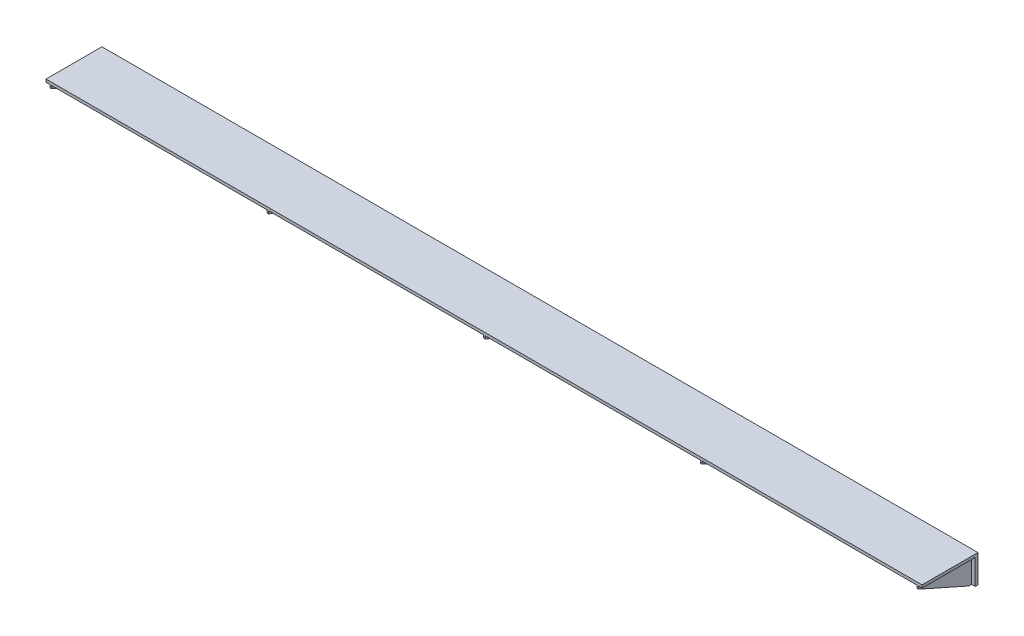
ISO-10303-21;
HEADER;
FILE_DESCRIPTION(('STEP AP214'),'2;1');
FILE_NAME('part.step','',(''),(''),'','','');
FILE_SCHEMA(('AUTOMOTIVE_DESIGN { 1 0 10303 214 1 1 1 1 }'));
ENDSEC;
DATA;
#1=APPLICATION_CONTEXT('core data for automotive mechanical design processes');
#2=APPLICATION_PROTOCOL_DEFINITION('international standard','automotive_design',2000,#1);
#3=PRODUCT_CONTEXT('',#1,'mechanical');
#4=PRODUCT('Part','Part','',(#3));
#5=PRODUCT_RELATED_PRODUCT_CATEGORY('part','',(#4));
#6=PRODUCT_DEFINITION_FORMATION('','',#4);
#7=PRODUCT_DEFINITION_CONTEXT('part definition',#1,'design');
#8=PRODUCT_DEFINITION('design','',#6,#7);
#9=PRODUCT_DEFINITION_SHAPE('','',#8);
#10=(LENGTH_UNIT() NAMED_UNIT(*) SI_UNIT(.MILLI.,.METRE.));
#11=(NAMED_UNIT(*) PLANE_ANGLE_UNIT() SI_UNIT($,.RADIAN.));
#12=(NAMED_UNIT(*) SI_UNIT($,.STERADIAN.) SOLID_ANGLE_UNIT());
#13=UNCERTAINTY_MEASURE_WITH_UNIT(LENGTH_MEASURE(1.E-05),#10,'distance_accuracy_value','');
#14=(GEOMETRIC_REPRESENTATION_CONTEXT(3) GLOBAL_UNCERTAINTY_ASSIGNED_CONTEXT((#13)) GLOBAL_UNIT_ASSIGNED_CONTEXT((#10,
#11,#12)) REPRESENTATION_CONTEXT('',''));
#15=CARTESIAN_POINT('',(0.,0.,0.));
#16=DIRECTION('',(0.,0.,1.));
#17=DIRECTION('',(1.,0.,0.));
#18=AXIS2_PLACEMENT_3D('',#15,#16,#17);
#19=CARTESIAN_POINT('',(0.,0.,20.));
#20=DIRECTION('',(0.,0.,-1.));
#21=DIRECTION('',(-1.,0.,0.));
#22=AXIS2_PLACEMENT_3D('',#19,#20,#21);
#23=PLANE('',#22);
#24=DIRECTION('',(0.,-1.,0.));
#25=VECTOR('',#24,1.);
#26=CARTESIAN_POINT('',(3107.2,80.,20.));
#27=LINE('',#26,#25);
#28=CARTESIAN_POINT('',(3107.2,80.,20.));
#29=VERTEX_POINT('',#28);
#30=CARTESIAN_POINT('',(3107.2,-100.,20.));
#31=VERTEX_POINT('',#30);
#32=EDGE_CURVE('E238',#29,#31,#27,.T.);
#33=ORIENTED_EDGE('',*,*,#32,.T.);
#34=DIRECTION('',(1.,0.,0.));
#35=VECTOR('',#34,1.);
#36=CARTESIAN_POINT('',(-3132.8,-100.,20.));
#37=LINE('',#36,#35);
#38=CARTESIAN_POINT('',(3132.8,-100.,20.));
#39=VERTEX_POINT('',#38);
#40=EDGE_CURVE('E37',#31,#39,#37,.T.);
#41=ORIENTED_EDGE('',*,*,#40,.T.);
#42=DIRECTION('',(0.,1.,0.));
#43=VECTOR('',#42,1.);
#44=CARTESIAN_POINT('',(3132.8,-100.,20.));
#45=LINE('',#44,#43);
#46=CARTESIAN_POINT('',(3132.8,80.,20.));
#47=VERTEX_POINT('',#46);
#48=EDGE_CURVE('E259',#39,#47,#45,.T.);
#49=ORIENTED_EDGE('',*,*,#48,.T.);
#50=DIRECTION('',(1.,0.,0.));
#51=VECTOR('',#50,1.);
#52=CARTESIAN_POINT('',(-3132.8,80.,20.));
#53=LINE('',#52,#51);
#54=EDGE_CURVE('E253',#29,#47,#53,.T.);
#55=ORIENTED_EDGE('',*,*,#54,.F.);
#56=EDGE_LOOP('',(#33,#41,#49,#55));
#57=FACE_BOUND('',#56,.T.);
#58=ADVANCED_FACE('F33',(#57),#23,.F.);
#59=CARTESIAN_POINT('',(-3132.8,80.,400.));
#60=DIRECTION('',(0.,1.,0.));
#61=DIRECTION('',(-1.,0.,0.));
#62=AXIS2_PLACEMENT_3D('',#59,#60,#61);
#63=PLANE('',#62);
#64=DIRECTION('',(0.,0.,-1.));
#65=VECTOR('',#64,1.);
#66=CARTESIAN_POINT('',(3107.2,80.,400.));
#67=LINE('',#66,#65);
#68=CARTESIAN_POINT('',(3107.2,80.,400.));
#69=VERTEX_POINT('',#68);
#70=EDGE_CURVE('E241',#69,#29,#67,.T.);
#71=ORIENTED_EDGE('',*,*,#70,.T.);
#72=ORIENTED_EDGE('',*,*,#54,.T.);
#73=DIRECTION('',(0.,0.,-1.));
#74=VECTOR('',#73,1.);
#75=CARTESIAN_POINT('',(3132.8,80.,400.));
#76=LINE('',#75,#74);
#77=CARTESIAN_POINT('',(3132.8,80.,400.));
#78=VERTEX_POINT('',#77);
#79=EDGE_CURVE('E388',#78,#47,#76,.T.);
#80=ORIENTED_EDGE('',*,*,#79,.F.);
#81=DIRECTION('',(1.,0.,0.));
#82=VECTOR('',#81,1.);
#83=CARTESIAN_POINT('',(-3132.8,80.,400.));
#84=LINE('',#83,#82);
#85=EDGE_CURVE('E255',#69,#78,#84,.T.);
#86=ORIENTED_EDGE('',*,*,#85,.F.);
#87=EDGE_LOOP('',(#71,#72,#80,#86));
#88=FACE_BOUND('',#87,.T.);
#89=ADVANCED_FACE('F251',(#88),#63,.F.);
#90=CARTESIAN_POINT('',(1557.2,-100.,20.));
#91=VERTEX_POINT('',#90);
#92=CARTESIAN_POINT('',(3097.2,-100.,20.));
#93=VERTEX_POINT('',#92);
#94=EDGE_CURVE('E446',#91,#93,#37,.T.);
#95=ORIENTED_EDGE('',*,*,#94,.T.);
#96=DIRECTION('',(0.,-1.,0.));
#97=VECTOR('',#96,1.);
#98=CARTESIAN_POINT('',(3097.2,80.,20.));
#99=LINE('',#98,#97);
#100=CARTESIAN_POINT('',(3097.2,80.,20.));
#101=VERTEX_POINT('',#100);
#102=EDGE_CURVE('E538',#101,#93,#99,.T.);
#103=ORIENTED_EDGE('',*,*,#102,.F.);
#104=CARTESIAN_POINT('',(1557.2,80.,20.));
#105=VERTEX_POINT('',#104);
#106=EDGE_CURVE('E260',#105,#101,#53,.T.);
#107=ORIENTED_EDGE('',*,*,#106,.F.);
#108=DIRECTION('',(0.,-1.,0.));
#109=VECTOR('',#108,1.);
#110=CARTESIAN_POINT('',(1557.2,80.,20.));
#111=LINE('',#110,#109);
#112=EDGE_CURVE('E551',#105,#91,#111,.T.);
#113=ORIENTED_EDGE('',*,*,#112,.T.);
#114=EDGE_LOOP('',(#95,#103,#107,#113));
#115=FACE_BOUND('',#114,.T.);
#116=ADVANCED_FACE('F565',(#115),#23,.F.);
#117=ORIENTED_EDGE('',*,*,#106,.T.);
#118=DIRECTION('',(0.,0.,-1.));
#119=VECTOR('',#118,1.);
#120=CARTESIAN_POINT('',(3097.2,80.,400.));
#121=LINE('',#120,#119);
#122=CARTESIAN_POINT('',(3097.2,80.,400.));
#123=VERTEX_POINT('',#122);
#124=EDGE_CURVE('E536',#123,#101,#121,.T.);
#125=ORIENTED_EDGE('',*,*,#124,.F.);
#126=CARTESIAN_POINT('',(1557.2,80.,400.));
#127=VERTEX_POINT('',#126);
#128=EDGE_CURVE('E511',#127,#123,#84,.T.);
#129=ORIENTED_EDGE('',*,*,#128,.F.);
#130=DIRECTION('',(0.,0.,-1.));
#131=VECTOR('',#130,1.);
#132=CARTESIAN_POINT('',(1557.2,80.,400.));
#133=LINE('',#132,#131);
#134=EDGE_CURVE('E548',#127,#105,#133,.T.);
#135=ORIENTED_EDGE('',*,*,#134,.T.);
#136=EDGE_LOOP('',(#117,#125,#129,#135));
#137=FACE_BOUND('',#136,.T.);
#138=ADVANCED_FACE('F568',(#137),#63,.F.);
#139=CARTESIAN_POINT('',(7.20000000000006,-100.,20.));
#140=VERTEX_POINT('',#139);
#141=CARTESIAN_POINT('',(1547.2,-100.,20.));
#142=VERTEX_POINT('',#141);
#143=EDGE_CURVE('E307',#140,#142,#37,.T.);
#144=ORIENTED_EDGE('',*,*,#143,.T.);
#145=DIRECTION('',(0.,-1.,0.));
#146=VECTOR('',#145,1.);
#147=CARTESIAN_POINT('',(1547.2,80.,20.));
#148=LINE('',#147,#146);
#149=CARTESIAN_POINT('',(1547.2,80.,20.));
#150=VERTEX_POINT('',#149);
#151=EDGE_CURVE('E306',#150,#142,#148,.T.);
#152=ORIENTED_EDGE('',*,*,#151,.F.);
#153=CARTESIAN_POINT('',(7.20000000000006,80.,20.));
#154=VERTEX_POINT('',#153);
#155=EDGE_CURVE('E265',#154,#150,#53,.T.);
#156=ORIENTED_EDGE('',*,*,#155,.F.);
#157=DIRECTION('',(0.,-1.,0.));
#158=VECTOR('',#157,1.);
#159=CARTESIAN_POINT('',(7.20000000000006,80.,20.));
#160=LINE('',#159,#158);
#161=EDGE_CURVE('E303',#154,#140,#160,.T.);
#162=ORIENTED_EDGE('',*,*,#161,.T.);
#163=EDGE_LOOP('',(#144,#152,#156,#162));
#164=FACE_BOUND('',#163,.T.);
#165=ADVANCED_FACE('F302',(#164),#23,.F.);
#166=ORIENTED_EDGE('',*,*,#155,.T.);
#167=DIRECTION('',(0.,0.,-1.));
#168=VECTOR('',#167,1.);
#169=CARTESIAN_POINT('',(1547.2,80.,400.));
#170=LINE('',#169,#168);
#171=CARTESIAN_POINT('',(1547.2,80.,400.));
#172=VERTEX_POINT('',#171);
#173=EDGE_CURVE('E294',#172,#150,#170,.T.);
#174=ORIENTED_EDGE('',*,*,#173,.F.);
#175=CARTESIAN_POINT('',(7.19999999999921,80.,400.));
#176=VERTEX_POINT('',#175);
#177=EDGE_CURVE('E508',#176,#172,#84,.T.);
#178=ORIENTED_EDGE('',*,*,#177,.F.);
#179=DIRECTION('',(0.,0.,-1.));
#180=VECTOR('',#179,1.);
#181=CARTESIAN_POINT('',(7.20000000000006,80.,400.));
#182=LINE('',#181,#180);
#183=EDGE_CURVE('E297',#176,#154,#182,.T.);
#184=ORIENTED_EDGE('',*,*,#183,.T.);
#185=EDGE_LOOP('',(#166,#174,#178,#184));
#186=FACE_BOUND('',#185,.T.);
#187=ADVANCED_FACE('F292',(#186),#63,.F.);
#188=CARTESIAN_POINT('',(-1542.8,-100.,20.));
#189=VERTEX_POINT('',#188);
#190=CARTESIAN_POINT('',(-2.79999999999994,-100.,20.));
#191=VERTEX_POINT('',#190);
#192=EDGE_CURVE('E430',#189,#191,#37,.T.);
#193=ORIENTED_EDGE('',*,*,#192,.T.);
#194=DIRECTION('',(0.,-1.,0.));
#195=VECTOR('',#194,1.);
#196=CARTESIAN_POINT('',(-2.79999999999994,80.,20.));
#197=LINE('',#196,#195);
#198=CARTESIAN_POINT('',(-2.79999999999994,80.,20.));
#199=VERTEX_POINT('',#198);
#200=EDGE_CURVE('E341',#199,#191,#197,.T.);
#201=ORIENTED_EDGE('',*,*,#200,.F.);
#202=CARTESIAN_POINT('',(-1542.8,80.,20.));
#203=VERTEX_POINT('',#202);
#204=EDGE_CURVE('E278',#203,#199,#53,.T.);
#205=ORIENTED_EDGE('',*,*,#204,.F.);
#206=DIRECTION('',(0.,-1.,0.));
#207=VECTOR('',#206,1.);
#208=CARTESIAN_POINT('',(-1542.8,80.,20.));
#209=LINE('',#208,#207);
#210=EDGE_CURVE('E359',#203,#189,#209,.T.);
#211=ORIENTED_EDGE('',*,*,#210,.T.);
#212=EDGE_LOOP('',(#193,#201,#205,#211));
#213=FACE_BOUND('',#212,.T.);
#214=ADVANCED_FACE('F598',(#213),#23,.F.);
#215=ORIENTED_EDGE('',*,*,#204,.T.);
#216=DIRECTION('',(0.,0.,-1.));
#217=VECTOR('',#216,1.);
#218=CARTESIAN_POINT('',(-2.79999999999994,80.,400.));
#219=LINE('',#218,#217);
#220=CARTESIAN_POINT('',(-2.79999999999994,80.,400.));
#221=VERTEX_POINT('',#220);
#222=EDGE_CURVE('E339',#221,#199,#219,.T.);
#223=ORIENTED_EDGE('',*,*,#222,.F.);
#224=CARTESIAN_POINT('',(-1542.8,80.,400.));
#225=VERTEX_POINT('',#224);
#226=EDGE_CURVE('E506',#225,#221,#84,.T.);
#227=ORIENTED_EDGE('',*,*,#226,.F.);
#228=DIRECTION('',(0.,0.,-1.));
#229=VECTOR('',#228,1.);
#230=CARTESIAN_POINT('',(-1542.8,80.,400.));
#231=LINE('',#230,#229);
#232=EDGE_CURVE('E356',#225,#203,#231,.T.);
#233=ORIENTED_EDGE('',*,*,#232,.T.);
#234=EDGE_LOOP('',(#215,#223,#227,#233));
#235=FACE_BOUND('',#234,.T.);
#236=ADVANCED_FACE('F593',(#235),#63,.F.);
#237=CARTESIAN_POINT('',(-3132.8,80.,20.));
#238=VERTEX_POINT('',#237);
#239=CARTESIAN_POINT('',(-3102.8,80.,20.));
#240=VERTEX_POINT('',#239);
#241=EDGE_CURVE('E263',#238,#240,#53,.T.);
#242=ORIENTED_EDGE('',*,*,#241,.F.);
#243=DIRECTION('',(0.,-1.,0.));
#244=VECTOR('',#243,1.);
#245=CARTESIAN_POINT('',(-3132.8,-100.,20.));
#246=LINE('',#245,#244);
#247=CARTESIAN_POINT('',(-3132.8,-100.,20.));
#248=VERTEX_POINT('',#247);
#249=EDGE_CURVE('E436',#238,#248,#246,.T.);
#250=ORIENTED_EDGE('',*,*,#249,.T.);
#251=CARTESIAN_POINT('',(-3102.8,-100.,20.));
#252=VERTEX_POINT('',#251);
#253=EDGE_CURVE('E444',#248,#252,#37,.T.);
#254=ORIENTED_EDGE('',*,*,#253,.T.);
#255=DIRECTION('',(0.,-1.,0.));
#256=VECTOR('',#255,1.);
#257=CARTESIAN_POINT('',(-3102.8,80.,20.));
#258=LINE('',#257,#256);
#259=EDGE_CURVE('E422',#240,#252,#258,.T.);
#260=ORIENTED_EDGE('',*,*,#259,.F.);
#261=EDGE_LOOP('',(#242,#250,#254,#260));
#262=FACE_BOUND('',#261,.T.);
#263=ADVANCED_FACE('F478',(#262),#23,.F.);
#264=CARTESIAN_POINT('',(-3092.8,-100.,20.));
#265=VERTEX_POINT('',#264);
#266=CARTESIAN_POINT('',(-1552.8,-100.,20.));
#267=VERTEX_POINT('',#266);
#268=EDGE_CURVE('E413',#265,#267,#37,.T.);
#269=ORIENTED_EDGE('',*,*,#268,.T.);
#270=DIRECTION('',(0.,-1.,0.));
#271=VECTOR('',#270,1.);
#272=CARTESIAN_POINT('',(-1552.8,80.,20.));
#273=LINE('',#272,#271);
#274=CARTESIAN_POINT('',(-1552.8,80.,20.));
#275=VERTEX_POINT('',#274);
#276=EDGE_CURVE('E371',#275,#267,#273,.T.);
#277=ORIENTED_EDGE('',*,*,#276,.F.);
#278=CARTESIAN_POINT('',(-3092.8,80.,20.));
#279=VERTEX_POINT('',#278);
#280=EDGE_CURVE('E271',#279,#275,#53,.T.);
#281=ORIENTED_EDGE('',*,*,#280,.F.);
#282=DIRECTION('',(0.,-1.,0.));
#283=VECTOR('',#282,1.);
#284=CARTESIAN_POINT('',(-3092.8,80.,20.));
#285=LINE('',#284,#283);
#286=EDGE_CURVE('E403',#279,#265,#285,.T.);
#287=ORIENTED_EDGE('',*,*,#286,.T.);
#288=EDGE_LOOP('',(#269,#277,#281,#287));
#289=FACE_BOUND('',#288,.T.);
#290=ADVANCED_FACE('F496',(#289),#23,.F.);
#291=CARTESIAN_POINT('',(3132.8,-100.,20.));
#292=DIRECTION('',(-1.,0.,0.));
#293=DIRECTION('',(0.,0.,1.));
#294=AXIS2_PLACEMENT_3D('',#291,#292,#293);
#295=PLANE('',#294);
#296=DIRECTION('',(0.,1.,0.));
#297=VECTOR('',#296,1.);
#298=CARTESIAN_POINT('',(3132.8,-100.,0.));
#299=LINE('',#298,#297);
#300=CARTESIAN_POINT('',(3132.8,-100.,0.));
#301=VERTEX_POINT('',#300);
#302=CARTESIAN_POINT('',(3132.8,100.,0.));
#303=VERTEX_POINT('',#302);
#304=EDGE_CURVE('E438',#301,#303,#299,.T.);
#305=ORIENTED_EDGE('',*,*,#304,.T.);
#306=DIRECTION('',(0.,0.,-1.));
#307=VECTOR('',#306,1.);
#308=CARTESIAN_POINT('',(3132.8,100.,20.));
#309=LINE('',#308,#307);
#310=CARTESIAN_POINT('',(3132.8,100.,400.));
#311=VERTEX_POINT('',#310);
#312=EDGE_CURVE('E11',#311,#303,#309,.T.);
#313=ORIENTED_EDGE('',*,*,#312,.F.);
#314=DIRECTION('',(0.,1.,0.));
#315=VECTOR('',#314,1.);
#316=CARTESIAN_POINT('',(3132.8,100.,400.));
#317=LINE('',#316,#315);
#318=EDGE_CURVE('E383',#78,#311,#317,.T.);
#319=ORIENTED_EDGE('',*,*,#318,.F.);
#320=ORIENTED_EDGE('',*,*,#79,.T.);
#321=ORIENTED_EDGE('',*,*,#48,.F.);
#322=DIRECTION('',(0.,0.,-1.));
#323=VECTOR('',#322,1.);
#324=CARTESIAN_POINT('',(3132.8,-100.,20.));
#325=LINE('',#324,#323);
#326=EDGE_CURVE('E487',#39,#301,#325,.T.);
#327=ORIENTED_EDGE('',*,*,#326,.T.);
#328=EDGE_LOOP('',(#305,#313,#319,#320,#321,#327));
#329=FACE_BOUND('',#328,.T.);
#330=ADVANCED_FACE('F35',(#329),#295,.F.);
#331=CARTESIAN_POINT('',(-3132.8,100.,20.));
#332=DIRECTION('',(0.,-1.,0.));
#333=DIRECTION('',(0.,0.,-1.));
#334=AXIS2_PLACEMENT_3D('',#331,#332,#333);
#335=PLANE('',#334);
#336=DIRECTION('',(-1.,0.,0.));
#337=VECTOR('',#336,1.);
#338=CARTESIAN_POINT('',(-3132.8,100.,0.));
#339=LINE('',#338,#337);
#340=CARTESIAN_POINT('',(-3132.8,100.,0.));
#341=VERTEX_POINT('',#340);
#342=EDGE_CURVE('E519',#303,#341,#339,.T.);
#343=ORIENTED_EDGE('',*,*,#342,.T.);
#344=DIRECTION('',(0.,0.,-1.));
#345=VECTOR('',#344,1.);
#346=CARTESIAN_POINT('',(-3132.8,100.,20.));
#347=LINE('',#346,#345);
#348=CARTESIAN_POINT('',(-3132.8,100.,400.));
#349=VERTEX_POINT('',#348);
#350=EDGE_CURVE('E43',#349,#341,#347,.T.);
#351=ORIENTED_EDGE('',*,*,#350,.F.);
#352=DIRECTION('',(-1.,0.,0.));
#353=VECTOR('',#352,1.);
#354=CARTESIAN_POINT('',(-3132.8,100.,400.));
#355=LINE('',#354,#353);
#356=EDGE_CURVE('E386',#311,#349,#355,.T.);
#357=ORIENTED_EDGE('',*,*,#356,.F.);
#358=ORIENTED_EDGE('',*,*,#312,.T.);
#359=EDGE_LOOP('',(#343,#351,#357,#358));
#360=FACE_BOUND('',#359,.T.);
#361=ADVANCED_FACE('F518',(#360),#335,.F.);
#362=CARTESIAN_POINT('',(-3132.8,-100.,20.));
#363=DIRECTION('',(1.,0.,0.));
#364=DIRECTION('',(0.,0.,-1.));
#365=AXIS2_PLACEMENT_3D('',#362,#363,#364);
#366=PLANE('',#365);
#367=DIRECTION('',(0.,-1.,0.));
#368=VECTOR('',#367,1.);
#369=CARTESIAN_POINT('',(-3132.8,-100.,0.));
#370=LINE('',#369,#368);
#371=CARTESIAN_POINT('',(-3132.8,-100.,0.));
#372=VERTEX_POINT('',#371);
#373=EDGE_CURVE('E458',#341,#372,#370,.T.);
#374=ORIENTED_EDGE('',*,*,#373,.T.);
#375=DIRECTION('',(0.,0.,-1.));
#376=VECTOR('',#375,1.);
#377=CARTESIAN_POINT('',(-3132.8,-100.,20.));
#378=LINE('',#377,#376);
#379=EDGE_CURVE('E481',#248,#372,#378,.T.);
#380=ORIENTED_EDGE('',*,*,#379,.F.);
#381=ORIENTED_EDGE('',*,*,#249,.F.);
#382=DIRECTION('',(0.,0.,-1.));
#383=VECTOR('',#382,1.);
#384=CARTESIAN_POINT('',(-3132.8,80.,400.));
#385=LINE('',#384,#383);
#386=CARTESIAN_POINT('',(-3132.8,80.,400.));
#387=VERTEX_POINT('',#386);
#388=EDGE_CURVE('E391',#387,#238,#385,.T.);
#389=ORIENTED_EDGE('',*,*,#388,.F.);
#390=DIRECTION('',(0.,-1.,0.));
#391=VECTOR('',#390,1.);
#392=CARTESIAN_POINT('',(-3132.8,100.,400.));
#393=LINE('',#392,#391);
#394=EDGE_CURVE('E270',#349,#387,#393,.T.);
#395=ORIENTED_EDGE('',*,*,#394,.F.);
#396=ORIENTED_EDGE('',*,*,#350,.T.);
#397=EDGE_LOOP('',(#374,#380,#381,#389,#395,#396));
#398=FACE_BOUND('',#397,.T.);
#399=ADVANCED_FACE('F479',(#398),#366,.F.);
#400=CARTESIAN_POINT('',(-3132.8,-100.,20.));
#401=DIRECTION('',(0.,1.,0.));
#402=DIRECTION('',(0.,0.,1.));
#403=AXIS2_PLACEMENT_3D('',#400,#401,#402);
#404=PLANE('',#403);
#405=DIRECTION('',(1.,0.,0.));
#406=VECTOR('',#405,1.);
#407=CARTESIAN_POINT('',(-3132.8,-100.,0.));
#408=LINE('',#407,#406);
#409=EDGE_CURVE('E457',#372,#301,#408,.T.);
#410=ORIENTED_EDGE('',*,*,#409,.T.);
#411=ORIENTED_EDGE('',*,*,#326,.F.);
#412=ORIENTED_EDGE('',*,*,#40,.F.);
#413=DIRECTION('',(0.,0.,1.));
#414=VECTOR('',#413,1.);
#415=CARTESIAN_POINT('',(3107.2,-100.,20.));
#416=LINE('',#415,#414);
#417=CARTESIAN_POINT('',(3107.2,-100.,40.));
#418=VERTEX_POINT('',#417);
#419=EDGE_CURVE('E245',#31,#418,#416,.T.);
#420=ORIENTED_EDGE('',*,*,#419,.T.);
#421=DIRECTION('',(-1.,0.,0.));
#422=VECTOR('',#421,1.);
#423=CARTESIAN_POINT('',(3107.2,-100.,40.));
#424=LINE('',#423,#422);
#425=CARTESIAN_POINT('',(3097.2,-100.,40.));
#426=VERTEX_POINT('',#425);
#427=EDGE_CURVE('E524',#418,#426,#424,.T.);
#428=ORIENTED_EDGE('',*,*,#427,.T.);
#429=DIRECTION('',(0.,0.,1.));
#430=VECTOR('',#429,1.);
#431=CARTESIAN_POINT('',(3097.2,-100.,20.));
#432=LINE('',#431,#430);
#433=EDGE_CURVE('E541',#93,#426,#432,.T.);
#434=ORIENTED_EDGE('',*,*,#433,.F.);
#435=ORIENTED_EDGE('',*,*,#94,.F.);
#436=DIRECTION('',(0.,0.,1.));
#437=VECTOR('',#436,1.);
#438=CARTESIAN_POINT('',(1557.2,-100.,20.));
#439=LINE('',#438,#437);
#440=CARTESIAN_POINT('',(1557.2,-100.,40.));
#441=VERTEX_POINT('',#440);
#442=EDGE_CURVE('E553',#91,#441,#439,.T.);
#443=ORIENTED_EDGE('',*,*,#442,.T.);
#444=DIRECTION('',(-1.,0.,0.));
#445=VECTOR('',#444,1.);
#446=CARTESIAN_POINT('',(1557.2,-100.,40.));
#447=LINE('',#446,#445);
#448=CARTESIAN_POINT('',(1547.2,-100.,40.));
#449=VERTEX_POINT('',#448);
#450=EDGE_CURVE('E323',#441,#449,#447,.T.);
#451=ORIENTED_EDGE('',*,*,#450,.T.);
#452=DIRECTION('',(0.,0.,1.));
#453=VECTOR('',#452,1.);
#454=CARTESIAN_POINT('',(1547.2,-100.,20.));
#455=LINE('',#454,#453);
#456=EDGE_CURVE('E310',#142,#449,#455,.T.);
#457=ORIENTED_EDGE('',*,*,#456,.F.);
#458=ORIENTED_EDGE('',*,*,#143,.F.);
#459=DIRECTION('',(0.,0.,1.));
#460=VECTOR('',#459,1.);
#461=CARTESIAN_POINT('',(7.20000000000006,-100.,20.));
#462=LINE('',#461,#460);
#463=CARTESIAN_POINT('',(7.20000000000006,-100.,40.));
#464=VERTEX_POINT('',#463);
#465=EDGE_CURVE('E331',#140,#464,#462,.T.);
#466=ORIENTED_EDGE('',*,*,#465,.T.);
#467=DIRECTION('',(-1.,0.,0.));
#468=VECTOR('',#467,1.);
#469=CARTESIAN_POINT('',(7.20000000000006,-100.,40.));
#470=LINE('',#469,#468);
#471=CARTESIAN_POINT('',(-2.79999999999994,-100.,40.));
#472=VERTEX_POINT('',#471);
#473=EDGE_CURVE('E337',#464,#472,#470,.T.);
#474=ORIENTED_EDGE('',*,*,#473,.T.);
#475=DIRECTION('',(0.,0.,1.));
#476=VECTOR('',#475,1.);
#477=CARTESIAN_POINT('',(-2.79999999999994,-100.,20.));
#478=LINE('',#477,#476);
#479=EDGE_CURVE('E344',#191,#472,#478,.T.);
#480=ORIENTED_EDGE('',*,*,#479,.F.);
#481=ORIENTED_EDGE('',*,*,#192,.F.);
#482=DIRECTION('',(0.,0.,1.));
#483=VECTOR('',#482,1.);
#484=CARTESIAN_POINT('',(-1542.8,-100.,20.));
#485=LINE('',#484,#483);
#486=CARTESIAN_POINT('',(-1542.8,-100.,40.));
#487=VERTEX_POINT('',#486);
#488=EDGE_CURVE('E362',#189,#487,#485,.T.);
#489=ORIENTED_EDGE('',*,*,#488,.T.);
#490=DIRECTION('',(-1.,0.,0.));
#491=VECTOR('',#490,1.);
#492=CARTESIAN_POINT('',(-1542.8,-100.,40.));
#493=LINE('',#492,#491);
#494=CARTESIAN_POINT('',(-1552.8,-100.,40.));
#495=VERTEX_POINT('',#494);
#496=EDGE_CURVE('E266',#487,#495,#493,.T.);
#497=ORIENTED_EDGE('',*,*,#496,.T.);
#498=DIRECTION('',(0.,0.,1.));
#499=VECTOR('',#498,1.);
#500=CARTESIAN_POINT('',(-1552.8,-100.,20.));
#501=LINE('',#500,#499);
#502=EDGE_CURVE('E374',#267,#495,#501,.T.);
#503=ORIENTED_EDGE('',*,*,#502,.F.);
#504=ORIENTED_EDGE('',*,*,#268,.F.);
#505=DIRECTION('',(0.,0.,1.));
#506=VECTOR('',#505,1.);
#507=CARTESIAN_POINT('',(-3092.8,-100.,20.));
#508=LINE('',#507,#506);
#509=CARTESIAN_POINT('',(-3092.8,-100.,40.));
#510=VERTEX_POINT('',#509);
#511=EDGE_CURVE('E412',#265,#510,#508,.T.);
#512=ORIENTED_EDGE('',*,*,#511,.T.);
#513=DIRECTION('',(-1.,0.,0.));
#514=VECTOR('',#513,1.);
#515=CARTESIAN_POINT('',(-3092.8,-100.,40.));
#516=LINE('',#515,#514);
#517=CARTESIAN_POINT('',(-3102.8,-100.,40.));
#518=VERTEX_POINT('',#517);
#519=EDGE_CURVE('E461',#510,#518,#516,.T.);
#520=ORIENTED_EDGE('',*,*,#519,.T.);
#521=DIRECTION('',(0.,0.,1.));
#522=VECTOR('',#521,1.);
#523=CARTESIAN_POINT('',(-3102.8,-100.,20.));
#524=LINE('',#523,#522);
#525=EDGE_CURVE('E419',#252,#518,#524,.T.);
#526=ORIENTED_EDGE('',*,*,#525,.F.);
#527=ORIENTED_EDGE('',*,*,#253,.F.);
#528=ORIENTED_EDGE('',*,*,#379,.T.);
#529=EDGE_LOOP('',(#410,#411,#412,#420,#428,#434,#435,#443,#451,#457,#458,#466,#474,#480,#481,
#489,#497,#503,#504,#512,#520,#526,#527,#528));
#530=FACE_BOUND('',#529,.T.);
#531=ADVANCED_FACE('F489',(#530),#404,.F.);
#532=CARTESIAN_POINT('',(0.,0.,0.));
#533=DIRECTION('',(0.,0.,-1.));
#534=DIRECTION('',(-1.,0.,0.));
#535=AXIS2_PLACEMENT_3D('',#532,#533,#534);
#536=PLANE('',#535);
#537=ORIENTED_EDGE('',*,*,#304,.F.);
#538=ORIENTED_EDGE('',*,*,#409,.F.);
#539=ORIENTED_EDGE('',*,*,#373,.F.);
#540=ORIENTED_EDGE('',*,*,#342,.F.);
#541=EDGE_LOOP('',(#537,#538,#539,#540));
#542=FACE_BOUND('',#541,.T.);
#543=ADVANCED_FACE('F523',(#542),#536,.T.);
#544=CARTESIAN_POINT('',(-3092.8,60.,400.));
#545=DIRECTION('',(0.,0.,1.));
#546=DIRECTION('',(1.,0.,0.));
#547=AXIS2_PLACEMENT_3D('',#544,#545,#546);
#548=PLANE('',#547);
#549=DIRECTION('',(0.,1.,0.));
#550=VECTOR('',#549,1.);
#551=CARTESIAN_POINT('',(-3102.8,60.,400.));
#552=LINE('',#551,#550);
#553=CARTESIAN_POINT('',(-3102.8,60.,400.));
#554=VERTEX_POINT('',#553);
#555=CARTESIAN_POINT('',(-3102.8,80.,400.));
#556=VERTEX_POINT('',#555);
#557=EDGE_CURVE('E394',#554,#556,#552,.T.);
#558=ORIENTED_EDGE('',*,*,#557,.F.);
#559=DIRECTION('',(-1.,0.,0.));
#560=VECTOR('',#559,1.);
#561=CARTESIAN_POINT('',(-3092.8,60.,400.));
#562=LINE('',#561,#560);
#563=CARTESIAN_POINT('',(-3092.8,60.,400.));
#564=VERTEX_POINT('',#563);
#565=EDGE_CURVE('E463',#564,#554,#562,.T.);
#566=ORIENTED_EDGE('',*,*,#565,.F.);
#567=DIRECTION('',(0.,1.,0.));
#568=VECTOR('',#567,1.);
#569=CARTESIAN_POINT('',(-3092.8,60.,400.));
#570=LINE('',#569,#568);
#571=CARTESIAN_POINT('',(-3092.8,80.,400.));
#572=VERTEX_POINT('',#571);
#573=EDGE_CURVE('E397',#564,#572,#570,.T.);
#574=ORIENTED_EDGE('',*,*,#573,.T.);
#575=CARTESIAN_POINT('',(-1552.8,80.,400.));
#576=VERTEX_POINT('',#575);
#577=EDGE_CURVE('E384',#572,#576,#84,.T.);
#578=ORIENTED_EDGE('',*,*,#577,.T.);
#579=DIRECTION('',(0.,1.,0.));
#580=VECTOR('',#579,1.);
#581=CARTESIAN_POINT('',(-1552.8,60.,400.));
#582=LINE('',#581,#580);
#583=CARTESIAN_POINT('',(-1552.8,60.,400.));
#584=VERTEX_POINT('',#583);
#585=EDGE_CURVE('E351',#584,#576,#582,.T.);
#586=ORIENTED_EDGE('',*,*,#585,.F.);
#587=DIRECTION('',(-1.,0.,0.));
#588=VECTOR('',#587,1.);
#589=CARTESIAN_POINT('',(-1542.8,60.,400.));
#590=LINE('',#589,#588);
#591=CARTESIAN_POINT('',(-1542.8,60.,400.));
#592=VERTEX_POINT('',#591);
#593=EDGE_CURVE('E261',#592,#584,#590,.T.);
#594=ORIENTED_EDGE('',*,*,#593,.F.);
#595=DIRECTION('',(0.,1.,0.));
#596=VECTOR('',#595,1.);
#597=CARTESIAN_POINT('',(-1542.8,60.,400.));
#598=LINE('',#597,#596);
#599=EDGE_CURVE('E353',#592,#225,#598,.T.);
#600=ORIENTED_EDGE('',*,*,#599,.T.);
#601=ORIENTED_EDGE('',*,*,#226,.T.);
#602=DIRECTION('',(0.,1.,0.));
#603=VECTOR('',#602,1.);
#604=CARTESIAN_POINT('',(-2.79999999999994,60.,400.));
#605=LINE('',#604,#603);
#606=CARTESIAN_POINT('',(-2.79999999999994,60.,400.));
#607=VERTEX_POINT('',#606);
#608=EDGE_CURVE('E322',#607,#221,#605,.T.);
#609=ORIENTED_EDGE('',*,*,#608,.F.);
#610=DIRECTION('',(-1.,0.,0.));
#611=VECTOR('',#610,1.);
#612=CARTESIAN_POINT('',(7.20000000000006,60.,400.));
#613=LINE('',#612,#611);
#614=CARTESIAN_POINT('',(7.20000000000006,60.,400.));
#615=VERTEX_POINT('',#614);
#616=EDGE_CURVE('E349',#615,#607,#613,.T.);
#617=ORIENTED_EDGE('',*,*,#616,.F.);
#618=DIRECTION('',(0.,1.,0.));
#619=VECTOR('',#618,1.);
#620=CARTESIAN_POINT('',(7.20000000000006,60.,400.));
#621=LINE('',#620,#619);
#622=EDGE_CURVE('E326',#615,#176,#621,.T.);
#623=ORIENTED_EDGE('',*,*,#622,.T.);
#624=ORIENTED_EDGE('',*,*,#177,.T.);
#625=DIRECTION('',(0.,1.,0.));
#626=VECTOR('',#625,1.);
#627=CARTESIAN_POINT('',(1547.2,60.,400.));
#628=LINE('',#627,#626);
#629=CARTESIAN_POINT('',(1547.2,60.,400.));
#630=VERTEX_POINT('',#629);
#631=EDGE_CURVE('E314',#630,#172,#628,.T.);
#632=ORIENTED_EDGE('',*,*,#631,.F.);
#633=DIRECTION('',(-1.,0.,0.));
#634=VECTOR('',#633,1.);
#635=CARTESIAN_POINT('',(1557.2,60.,400.));
#636=LINE('',#635,#634);
#637=CARTESIAN_POINT('',(1557.2,60.,400.));
#638=VERTEX_POINT('',#637);
#639=EDGE_CURVE('E320',#638,#630,#636,.T.);
#640=ORIENTED_EDGE('',*,*,#639,.F.);
#641=DIRECTION('',(0.,1.,0.));
#642=VECTOR('',#641,1.);
#643=CARTESIAN_POINT('',(1557.2,60.,400.));
#644=LINE('',#643,#642);
#645=EDGE_CURVE('E58',#638,#127,#644,.T.);
#646=ORIENTED_EDGE('',*,*,#645,.T.);
#647=ORIENTED_EDGE('',*,*,#128,.T.);
#648=DIRECTION('',(0.,1.,0.));
#649=VECTOR('',#648,1.);
#650=CARTESIAN_POINT('',(3097.2,60.,400.));
#651=LINE('',#650,#649);
#652=CARTESIAN_POINT('',(3097.2,60.,400.));
#653=VERTEX_POINT('',#652);
#654=EDGE_CURVE('E534',#653,#123,#651,.T.);
#655=ORIENTED_EDGE('',*,*,#654,.F.);
#656=DIRECTION('',(-1.,0.,0.));
#657=VECTOR('',#656,1.);
#658=CARTESIAN_POINT('',(3107.2,60.,400.));
#659=LINE('',#658,#657);
#660=CARTESIAN_POINT('',(3107.2,60.,400.));
#661=VERTEX_POINT('',#660);
#662=EDGE_CURVE('E531',#661,#653,#659,.T.);
#663=ORIENTED_EDGE('',*,*,#662,.F.);
#664=DIRECTION('',(0.,1.,0.));
#665=VECTOR('',#664,1.);
#666=CARTESIAN_POINT('',(3107.2,60.,400.));
#667=LINE('',#666,#665);
#668=EDGE_CURVE('E51',#661,#69,#667,.T.);
#669=ORIENTED_EDGE('',*,*,#668,.T.);
#670=ORIENTED_EDGE('',*,*,#85,.T.);
#671=ORIENTED_EDGE('',*,*,#318,.T.);
#672=ORIENTED_EDGE('',*,*,#356,.T.);
#673=ORIENTED_EDGE('',*,*,#394,.T.);
#674=EDGE_CURVE('E380',#387,#556,#84,.T.);
#675=ORIENTED_EDGE('',*,*,#674,.T.);
#676=EDGE_LOOP('',(#558,#566,#574,#578,#586,#594,#600,#601,#609,#617,#623,#624,#632,#640,#646,
#647,#655,#663,#669,#670,#671,#672,#673,#675));
#677=FACE_BOUND('',#676,.T.);
#678=ADVANCED_FACE('F473',(#677),#548,.T.);
#679=CARTESIAN_POINT('',(-3092.8,-100.,40.));
#680=DIRECTION('',(0.,-0.913811548620257,0.406138466053448));
#681=DIRECTION('',(0.,-0.406138466053448,-0.913811548620257));
#682=AXIS2_PLACEMENT_3D('',#679,#680,#681);
#683=PLANE('',#682);
#684=DIRECTION('',(0.,0.406138466053448,0.913811548620257));
#685=VECTOR('',#684,1.);
#686=CARTESIAN_POINT('',(-3102.8,-100.,40.));
#687=LINE('',#686,#685);
#688=EDGE_CURVE('E401',#518,#554,#687,.T.);
#689=ORIENTED_EDGE('',*,*,#688,.F.);
#690=ORIENTED_EDGE('',*,*,#519,.F.);
#691=DIRECTION('',(0.,0.406138466053448,0.913811548620257));
#692=VECTOR('',#691,1.);
#693=CARTESIAN_POINT('',(-3092.8,-100.,40.));
#694=LINE('',#693,#692);
#695=EDGE_CURVE('E406',#510,#564,#694,.T.);
#696=ORIENTED_EDGE('',*,*,#695,.T.);
#697=ORIENTED_EDGE('',*,*,#565,.T.);
#698=EDGE_LOOP('',(#689,#690,#696,#697));
#699=FACE_BOUND('',#698,.T.);
#700=ADVANCED_FACE('F664',(#699),#683,.T.);
#701=CARTESIAN_POINT('',(-3092.8,0.,0.));
#702=DIRECTION('',(-1.,0.,0.));
#703=DIRECTION('',(0.,0.,1.));
#704=AXIS2_PLACEMENT_3D('',#701,#702,#703);
#705=PLANE('',#704);
#706=ORIENTED_EDGE('',*,*,#573,.F.);
#707=ORIENTED_EDGE('',*,*,#695,.F.);
#708=ORIENTED_EDGE('',*,*,#511,.F.);
#709=ORIENTED_EDGE('',*,*,#286,.F.);
#710=DIRECTION('',(0.,0.,-1.));
#711=VECTOR('',#710,1.);
#712=CARTESIAN_POINT('',(-3092.8,80.,400.));
#713=LINE('',#712,#711);
#714=EDGE_CURVE('E400',#572,#279,#713,.T.);
#715=ORIENTED_EDGE('',*,*,#714,.F.);
#716=EDGE_LOOP('',(#706,#707,#708,#709,#715));
#717=FACE_BOUND('',#716,.T.);
#718=ADVANCED_FACE('F804',(#717),#705,.F.);
#719=CARTESIAN_POINT('',(-3102.8,0.,0.));
#720=DIRECTION('',(-1.,0.,0.));
#721=DIRECTION('',(0.,0.,1.));
#722=AXIS2_PLACEMENT_3D('',#719,#720,#721);
#723=PLANE('',#722);
#724=ORIENTED_EDGE('',*,*,#557,.T.);
#725=DIRECTION('',(0.,0.,-1.));
#726=VECTOR('',#725,1.);
#727=CARTESIAN_POINT('',(-3102.8,80.,400.));
#728=LINE('',#727,#726);
#729=EDGE_CURVE('E427',#556,#240,#728,.T.);
#730=ORIENTED_EDGE('',*,*,#729,.T.);
#731=ORIENTED_EDGE('',*,*,#259,.T.);
#732=ORIENTED_EDGE('',*,*,#525,.T.);
#733=ORIENTED_EDGE('',*,*,#688,.T.);
#734=EDGE_LOOP('',(#724,#730,#731,#732,#733));
#735=FACE_BOUND('',#734,.T.);
#736=ADVANCED_FACE('F470',(#735),#723,.T.);
#737=ORIENTED_EDGE('',*,*,#280,.T.);
#738=DIRECTION('',(0.,0.,-1.));
#739=VECTOR('',#738,1.);
#740=CARTESIAN_POINT('',(-1552.8,80.,400.));
#741=LINE('',#740,#739);
#742=EDGE_CURVE('E369',#576,#275,#741,.T.);
#743=ORIENTED_EDGE('',*,*,#742,.F.);
#744=ORIENTED_EDGE('',*,*,#577,.F.);
#745=ORIENTED_EDGE('',*,*,#714,.T.);
#746=EDGE_LOOP('',(#737,#743,#744,#745));
#747=FACE_BOUND('',#746,.T.);
#748=ADVANCED_FACE('F504',(#747),#63,.F.);
#749=ORIENTED_EDGE('',*,*,#729,.F.);
#750=ORIENTED_EDGE('',*,*,#674,.F.);
#751=ORIENTED_EDGE('',*,*,#388,.T.);
#752=ORIENTED_EDGE('',*,*,#241,.T.);
#753=EDGE_LOOP('',(#749,#750,#751,#752));
#754=FACE_BOUND('',#753,.T.);
#755=ADVANCED_FACE('F476',(#754),#63,.F.);
#756=CARTESIAN_POINT('',(-1542.8,-100.,40.));
#757=DIRECTION('',(0.,-0.913811548620257,0.406138466053448));
#758=DIRECTION('',(0.,-0.406138466053448,-0.913811548620257));
#759=AXIS2_PLACEMENT_3D('',#756,#757,#758);
#760=PLANE('',#759);
#761=DIRECTION('',(0.,0.406138466053448,0.913811548620257));
#762=VECTOR('',#761,1.);
#763=CARTESIAN_POINT('',(-1552.8,-100.,40.));
#764=LINE('',#763,#762);
#765=EDGE_CURVE('E357',#495,#584,#764,.T.);
#766=ORIENTED_EDGE('',*,*,#765,.F.);
#767=ORIENTED_EDGE('',*,*,#496,.F.);
#768=DIRECTION('',(0.,0.406138466053448,0.913811548620257));
#769=VECTOR('',#768,1.);
#770=CARTESIAN_POINT('',(-1542.8,-100.,40.));
#771=LINE('',#770,#769);
#772=EDGE_CURVE('E365',#487,#592,#771,.T.);
#773=ORIENTED_EDGE('',*,*,#772,.T.);
#774=ORIENTED_EDGE('',*,*,#593,.T.);
#775=EDGE_LOOP('',(#766,#767,#773,#774));
#776=FACE_BOUND('',#775,.T.);
#777=ADVANCED_FACE('F680',(#776),#760,.T.);
#778=CARTESIAN_POINT('',(-1542.8,0.,0.));
#779=DIRECTION('',(-1.,0.,0.));
#780=DIRECTION('',(0.,0.,1.));
#781=AXIS2_PLACEMENT_3D('',#778,#779,#780);
#782=PLANE('',#781);
#783=ORIENTED_EDGE('',*,*,#599,.F.);
#784=ORIENTED_EDGE('',*,*,#772,.F.);
#785=ORIENTED_EDGE('',*,*,#488,.F.);
#786=ORIENTED_EDGE('',*,*,#210,.F.);
#787=ORIENTED_EDGE('',*,*,#232,.F.);
#788=EDGE_LOOP('',(#783,#784,#785,#786,#787));
#789=FACE_BOUND('',#788,.T.);
#790=ADVANCED_FACE('F684',(#789),#782,.F.);
#791=CARTESIAN_POINT('',(-1552.8,0.,0.));
#792=DIRECTION('',(-1.,0.,0.));
#793=DIRECTION('',(0.,0.,1.));
#794=AXIS2_PLACEMENT_3D('',#791,#792,#793);
#795=PLANE('',#794);
#796=ORIENTED_EDGE('',*,*,#585,.T.);
#797=ORIENTED_EDGE('',*,*,#742,.T.);
#798=ORIENTED_EDGE('',*,*,#276,.T.);
#799=ORIENTED_EDGE('',*,*,#502,.T.);
#800=ORIENTED_EDGE('',*,*,#765,.T.);
#801=EDGE_LOOP('',(#796,#797,#798,#799,#800));
#802=FACE_BOUND('',#801,.T.);
#803=ADVANCED_FACE('F501',(#802),#795,.T.);
#804=CARTESIAN_POINT('',(7.20000000000006,-100.,40.));
#805=DIRECTION('',(0.,-0.913811548620257,0.406138466053448));
#806=DIRECTION('',(0.,-0.406138466053448,-0.913811548620257));
#807=AXIS2_PLACEMENT_3D('',#804,#805,#806);
#808=PLANE('',#807);
#809=DIRECTION('',(0.,0.406138466053448,0.913811548620257));
#810=VECTOR('',#809,1.);
#811=CARTESIAN_POINT('',(-2.79999999999994,-100.,40.));
#812=LINE('',#811,#810);
#813=EDGE_CURVE('E328',#472,#607,#812,.T.);
#814=ORIENTED_EDGE('',*,*,#813,.F.);
#815=ORIENTED_EDGE('',*,*,#473,.F.);
#816=DIRECTION('',(0.,0.406138466053448,0.913811548620257));
#817=VECTOR('',#816,1.);
#818=CARTESIAN_POINT('',(7.20000000000006,-100.,40.));
#819=LINE('',#818,#817);
#820=EDGE_CURVE('E334',#464,#615,#819,.T.);
#821=ORIENTED_EDGE('',*,*,#820,.T.);
#822=ORIENTED_EDGE('',*,*,#616,.T.);
#823=EDGE_LOOP('',(#814,#815,#821,#822));
#824=FACE_BOUND('',#823,.T.);
#825=ADVANCED_FACE('F702',(#824),#808,.T.);
#826=CARTESIAN_POINT('',(7.20000000000006,0.,0.));
#827=DIRECTION('',(-1.,0.,0.));
#828=DIRECTION('',(0.,0.,1.));
#829=AXIS2_PLACEMENT_3D('',#826,#827,#828);
#830=PLANE('',#829);
#831=ORIENTED_EDGE('',*,*,#622,.F.);
#832=ORIENTED_EDGE('',*,*,#820,.F.);
#833=ORIENTED_EDGE('',*,*,#465,.F.);
#834=ORIENTED_EDGE('',*,*,#161,.F.);
#835=ORIENTED_EDGE('',*,*,#183,.F.);
#836=EDGE_LOOP('',(#831,#832,#833,#834,#835));
#837=FACE_BOUND('',#836,.T.);
#838=ADVANCED_FACE('F711',(#837),#830,.F.);
#839=CARTESIAN_POINT('',(-2.79999999999994,0.,0.));
#840=DIRECTION('',(-1.,0.,0.));
#841=DIRECTION('',(0.,0.,1.));
#842=AXIS2_PLACEMENT_3D('',#839,#840,#841);
#843=PLANE('',#842);
#844=ORIENTED_EDGE('',*,*,#608,.T.);
#845=ORIENTED_EDGE('',*,*,#222,.T.);
#846=ORIENTED_EDGE('',*,*,#200,.T.);
#847=ORIENTED_EDGE('',*,*,#479,.T.);
#848=ORIENTED_EDGE('',*,*,#813,.T.);
#849=EDGE_LOOP('',(#844,#845,#846,#847,#848));
#850=FACE_BOUND('',#849,.T.);
#851=ADVANCED_FACE('F721',(#850),#843,.T.);
#852=CARTESIAN_POINT('',(1557.2,-100.,40.));
#853=DIRECTION('',(0.,-0.913811548620257,0.406138466053448));
#854=DIRECTION('',(0.,-0.406138466053448,-0.913811548620257));
#855=AXIS2_PLACEMENT_3D('',#852,#853,#854);
#856=PLANE('',#855);
#857=DIRECTION('',(0.,0.406138466053448,0.913811548620257));
#858=VECTOR('',#857,1.);
#859=CARTESIAN_POINT('',(1547.2,-100.,40.));
#860=LINE('',#859,#858);
#861=EDGE_CURVE('E312',#449,#630,#860,.T.);
#862=ORIENTED_EDGE('',*,*,#861,.F.);
#863=ORIENTED_EDGE('',*,*,#450,.F.);
#864=DIRECTION('',(0.,0.406138466053448,0.913811548620257));
#865=VECTOR('',#864,1.);
#866=CARTESIAN_POINT('',(1557.2,-100.,40.));
#867=LINE('',#866,#865);
#868=EDGE_CURVE('E325',#441,#638,#867,.T.);
#869=ORIENTED_EDGE('',*,*,#868,.T.);
#870=ORIENTED_EDGE('',*,*,#639,.T.);
#871=EDGE_LOOP('',(#862,#863,#869,#870));
#872=FACE_BOUND('',#871,.T.);
#873=ADVANCED_FACE('F563',(#872),#856,.T.);
#874=CARTESIAN_POINT('',(1557.2,0.,0.));
#875=DIRECTION('',(-1.,0.,0.));
#876=DIRECTION('',(0.,0.,1.));
#877=AXIS2_PLACEMENT_3D('',#874,#875,#876);
#878=PLANE('',#877);
#879=ORIENTED_EDGE('',*,*,#645,.F.);
#880=ORIENTED_EDGE('',*,*,#868,.F.);
#881=ORIENTED_EDGE('',*,*,#442,.F.);
#882=ORIENTED_EDGE('',*,*,#112,.F.);
#883=ORIENTED_EDGE('',*,*,#134,.F.);
#884=EDGE_LOOP('',(#879,#880,#881,#882,#883));
#885=FACE_BOUND('',#884,.T.);
#886=ADVANCED_FACE('F562',(#885),#878,.F.);
#887=CARTESIAN_POINT('',(1547.2,0.,0.));
#888=DIRECTION('',(-1.,0.,0.));
#889=DIRECTION('',(0.,0.,1.));
#890=AXIS2_PLACEMENT_3D('',#887,#888,#889);
#891=PLANE('',#890);
#892=ORIENTED_EDGE('',*,*,#631,.T.);
#893=ORIENTED_EDGE('',*,*,#173,.T.);
#894=ORIENTED_EDGE('',*,*,#151,.T.);
#895=ORIENTED_EDGE('',*,*,#456,.T.);
#896=ORIENTED_EDGE('',*,*,#861,.T.);
#897=EDGE_LOOP('',(#892,#893,#894,#895,#896));
#898=FACE_BOUND('',#897,.T.);
#899=ADVANCED_FACE('F557',(#898),#891,.T.);
#900=CARTESIAN_POINT('',(3107.2,-100.,40.));
#901=DIRECTION('',(0.,-0.913811548620257,0.406138466053448));
#902=DIRECTION('',(0.,-0.406138466053448,-0.913811548620257));
#903=AXIS2_PLACEMENT_3D('',#900,#901,#902);
#904=PLANE('',#903);
#905=DIRECTION('',(0.,0.406138466053448,0.913811548620257));
#906=VECTOR('',#905,1.);
#907=CARTESIAN_POINT('',(3097.2,-100.,40.));
#908=LINE('',#907,#906);
#909=EDGE_CURVE('E543',#426,#653,#908,.T.);
#910=ORIENTED_EDGE('',*,*,#909,.F.);
#911=ORIENTED_EDGE('',*,*,#427,.F.);
#912=DIRECTION('',(0.,0.406138466053448,0.913811548620257));
#913=VECTOR('',#912,1.);
#914=CARTESIAN_POINT('',(3107.2,-100.,40.));
#915=LINE('',#914,#913);
#916=EDGE_CURVE('E526',#418,#661,#915,.T.);
#917=ORIENTED_EDGE('',*,*,#916,.T.);
#918=ORIENTED_EDGE('',*,*,#662,.T.);
#919=EDGE_LOOP('',(#910,#911,#917,#918));
#920=FACE_BOUND('',#919,.T.);
#921=ADVANCED_FACE('F572',(#920),#904,.T.);
#922=CARTESIAN_POINT('',(3107.2,0.,0.));
#923=DIRECTION('',(-1.,0.,0.));
#924=DIRECTION('',(0.,0.,1.));
#925=AXIS2_PLACEMENT_3D('',#922,#923,#924);
#926=PLANE('',#925);
#927=ORIENTED_EDGE('',*,*,#668,.F.);
#928=ORIENTED_EDGE('',*,*,#916,.F.);
#929=ORIENTED_EDGE('',*,*,#419,.F.);
#930=ORIENTED_EDGE('',*,*,#32,.F.);
#931=ORIENTED_EDGE('',*,*,#70,.F.);
#932=EDGE_LOOP('',(#927,#928,#929,#930,#931));
#933=FACE_BOUND('',#932,.T.);
#934=ADVANCED_FACE('F240',(#933),#926,.F.);
#935=CARTESIAN_POINT('',(3097.2,0.,0.));
#936=DIRECTION('',(-1.,0.,0.));
#937=DIRECTION('',(0.,0.,1.));
#938=AXIS2_PLACEMENT_3D('',#935,#936,#937);
#939=PLANE('',#938);
#940=ORIENTED_EDGE('',*,*,#654,.T.);
#941=ORIENTED_EDGE('',*,*,#124,.T.);
#942=ORIENTED_EDGE('',*,*,#102,.T.);
#943=ORIENTED_EDGE('',*,*,#433,.T.);
#944=ORIENTED_EDGE('',*,*,#909,.T.);
#945=EDGE_LOOP('',(#940,#941,#942,#943,#944));
#946=FACE_BOUND('',#945,.T.);
#947=ADVANCED_FACE('F570',(#946),#939,.T.);
#948=CLOSED_SHELL('',(#58,#89,#116,#138,#165,#187,#214,#236,#263,#290,#330,#361,#399,#531,#543,
#678,#700,#718,#736,#748,#755,#777,#790,#803,#825,#838,#851,#873,#886,#899,#921,#934,#947));
#949=MANIFOLD_SOLID_BREP('B2',#948);
#950=ADVANCED_BREP_SHAPE_REPRESENTATION('',(#18,#949),#14);
#951=SHAPE_DEFINITION_REPRESENTATION(#9,#950);
ENDSEC;
END-ISO-10303-21;
